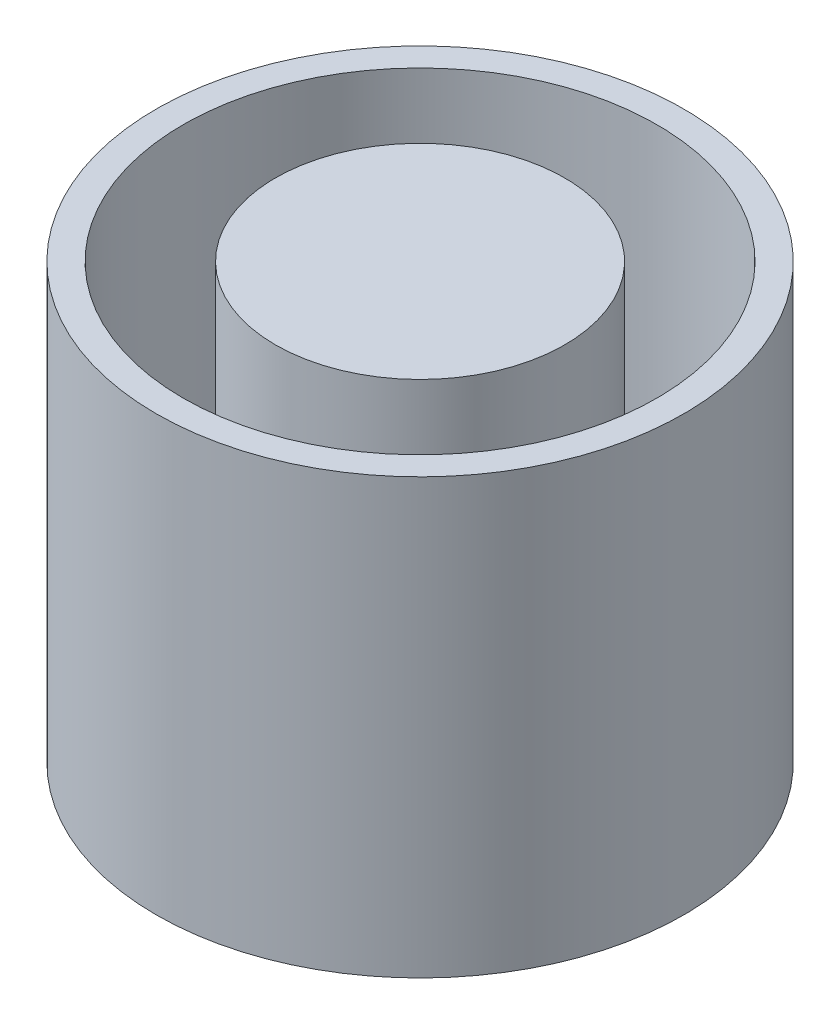
ISO-10303-21;
HEADER;
FILE_DESCRIPTION(('STEP AP214'),'2;1');
FILE_NAME('part.step','',(''),(''),'','','');
FILE_SCHEMA(('AUTOMOTIVE_DESIGN { 1 0 10303 214 1 1 1 1 }'));
ENDSEC;
DATA;
#1=APPLICATION_CONTEXT('core data for automotive mechanical design processes');
#2=APPLICATION_PROTOCOL_DEFINITION('international standard','automotive_design',2000,#1);
#3=PRODUCT_CONTEXT('',#1,'mechanical');
#4=PRODUCT('Part','Part','',(#3));
#5=PRODUCT_RELATED_PRODUCT_CATEGORY('part','',(#4));
#6=PRODUCT_DEFINITION_FORMATION('','',#4);
#7=PRODUCT_DEFINITION_CONTEXT('part definition',#1,'design');
#8=PRODUCT_DEFINITION('design','',#6,#7);
#9=PRODUCT_DEFINITION_SHAPE('','',#8);
#10=(LENGTH_UNIT() NAMED_UNIT(*) SI_UNIT(.MILLI.,.METRE.));
#11=(NAMED_UNIT(*) PLANE_ANGLE_UNIT() SI_UNIT($,.RADIAN.));
#12=(NAMED_UNIT(*) SI_UNIT($,.STERADIAN.) SOLID_ANGLE_UNIT());
#13=UNCERTAINTY_MEASURE_WITH_UNIT(LENGTH_MEASURE(1.E-05),#10,'distance_accuracy_value','');
#14=(GEOMETRIC_REPRESENTATION_CONTEXT(3) GLOBAL_UNCERTAINTY_ASSIGNED_CONTEXT((#13)) GLOBAL_UNIT_ASSIGNED_CONTEXT((#10,
#11,#12)) REPRESENTATION_CONTEXT('',''));
#15=CARTESIAN_POINT('',(0.,0.,0.));
#16=DIRECTION('',(0.,0.,1.));
#17=DIRECTION('',(1.,0.,0.));
#18=AXIS2_PLACEMENT_3D('',#15,#16,#17);
#19=CARTESIAN_POINT('',(0.,100.,0.));
#20=DIRECTION('',(0.,-1.,0.));
#21=DIRECTION('',(0.,0.,-1.));
#22=AXIS2_PLACEMENT_3D('',#19,#20,#21);
#23=CYLINDRICAL_SURFACE('',#22,54.5797701484338);
#24=CARTESIAN_POINT('',(0.,9.99999999999999,0.));
#25=DIRECTION('',(0.,1.,0.));
#26=DIRECTION('',(0.,0.,1.));
#27=AXIS2_PLACEMENT_3D('',#24,#25,#26);
#28=CIRCLE('',#27,54.5797701484338);
#29=CARTESIAN_POINT('',(0.,9.99999999999999,54.5797701484338));
#30=VERTEX_POINT('',#29);
#31=EDGE_CURVE('E11',#30,#30,#28,.T.);
#32=ORIENTED_EDGE('',*,*,#31,.F.);
#33=EDGE_LOOP('',(#32));
#34=FACE_BOUND('',#33,.T.);
#35=CARTESIAN_POINT('',(0.,100.,0.));
#36=DIRECTION('',(0.,1.,0.));
#37=DIRECTION('',(0.,0.,1.));
#38=AXIS2_PLACEMENT_3D('',#35,#36,#37);
#39=CIRCLE('',#38,54.5797701484338);
#40=CARTESIAN_POINT('',(0.,100.,54.5797701484338));
#41=VERTEX_POINT('',#40);
#42=EDGE_CURVE('E51',#41,#41,#39,.T.);
#43=ORIENTED_EDGE('',*,*,#42,.T.);
#44=EDGE_LOOP('',(#43));
#45=FACE_BOUND('',#44,.T.);
#46=ADVANCED_FACE('F41',(#34,#45),#23,.F.);
#47=CARTESIAN_POINT('',(0.,100.,0.));
#48=DIRECTION('',(0.,-1.,0.));
#49=DIRECTION('',(0.,0.,-1.));
#50=AXIS2_PLACEMENT_3D('',#47,#48,#49);
#51=CYLINDRICAL_SURFACE('',#50,60.8020056587238);
#52=CARTESIAN_POINT('',(0.,100.,0.));
#53=DIRECTION('',(0.,1.,0.));
#54=DIRECTION('',(0.,0.,1.));
#55=AXIS2_PLACEMENT_3D('',#52,#53,#54);
#56=CIRCLE('',#55,60.8020056587238);
#57=CARTESIAN_POINT('',(0.,100.,60.8020056587238));
#58=VERTEX_POINT('',#57);
#59=EDGE_CURVE('E47',#58,#58,#56,.T.);
#60=ORIENTED_EDGE('',*,*,#59,.F.);
#61=EDGE_LOOP('',(#60));
#62=FACE_BOUND('',#61,.T.);
#63=CARTESIAN_POINT('',(0.,0.,0.));
#64=DIRECTION('',(0.,1.,0.));
#65=DIRECTION('',(0.,0.,1.));
#66=AXIS2_PLACEMENT_3D('',#63,#64,#65);
#67=CIRCLE('',#66,60.8020056587238);
#68=CARTESIAN_POINT('',(0.,0.,60.8020056587238));
#69=VERTEX_POINT('',#68);
#70=EDGE_CURVE('E56',#69,#69,#67,.T.);
#71=ORIENTED_EDGE('',*,*,#70,.T.);
#72=EDGE_LOOP('',(#71));
#73=FACE_BOUND('',#72,.T.);
#74=ADVANCED_FACE('F90',(#62,#73),#51,.T.);
#75=CARTESIAN_POINT('',(0.,100.,0.));
#76=DIRECTION('',(0.,1.,0.));
#77=DIRECTION('',(0.,0.,1.));
#78=AXIS2_PLACEMENT_3D('',#75,#76,#77);
#79=PLANE('',#78);
#80=ORIENTED_EDGE('',*,*,#42,.F.);
#81=EDGE_LOOP('',(#80));
#82=FACE_BOUND('',#81,.T.);
#83=ORIENTED_EDGE('',*,*,#59,.T.);
#84=EDGE_LOOP('',(#83));
#85=FACE_BOUND('',#84,.T.);
#86=ADVANCED_FACE('F95',(#82,#85),#79,.T.);
#87=CARTESIAN_POINT('',(0.,0.,0.));
#88=DIRECTION('',(0.,1.,0.));
#89=DIRECTION('',(0.,0.,1.));
#90=AXIS2_PLACEMENT_3D('',#87,#88,#89);
#91=PLANE('',#90);
#92=ORIENTED_EDGE('',*,*,#70,.F.);
#93=EDGE_LOOP('',(#92));
#94=FACE_BOUND('',#93,.T.);
#95=CARTESIAN_POINT('',(0.,0.,0.));
#96=DIRECTION('',(0.,1.,0.));
#97=DIRECTION('',(0.,0.,1.));
#98=AXIS2_PLACEMENT_3D('',#95,#96,#97);
#99=CIRCLE('',#98,14.0708311486429);
#100=CARTESIAN_POINT('',(0.,0.,14.0708311486429));
#101=VERTEX_POINT('',#100);
#102=EDGE_CURVE('E68',#101,#101,#99,.T.);
#103=ORIENTED_EDGE('',*,*,#102,.T.);
#104=EDGE_LOOP('',(#103));
#105=FACE_BOUND('',#104,.T.);
#106=ADVANCED_FACE('F101',(#94,#105),#91,.F.);
#107=CARTESIAN_POINT('',(0.,10.,0.));
#108=DIRECTION('',(0.,1.,0.));
#109=DIRECTION('',(0.,0.,1.));
#110=AXIS2_PLACEMENT_3D('',#107,#108,#109);
#111=PLANE('',#110);
#112=CARTESIAN_POINT('',(0.,10.,0.));
#113=DIRECTION('',(0.,1.,0.));
#114=DIRECTION('',(0.,0.,1.));
#115=AXIS2_PLACEMENT_3D('',#112,#113,#114);
#116=CIRCLE('',#115,33.324434683967);
#117=CARTESIAN_POINT('',(0.,10.,33.324434683967));
#118=VERTEX_POINT('',#117);
#119=EDGE_CURVE('E60',#118,#118,#116,.T.);
#120=ORIENTED_EDGE('',*,*,#119,.F.);
#121=EDGE_LOOP('',(#120));
#122=FACE_BOUND('',#121,.T.);
#123=ORIENTED_EDGE('',*,*,#31,.T.);
#124=EDGE_LOOP('',(#123));
#125=FACE_BOUND('',#124,.T.);
#126=ADVANCED_FACE('F106',(#122,#125),#111,.T.);
#127=CARTESIAN_POINT('',(0.,100.,0.));
#128=DIRECTION('',(0.,1.,0.));
#129=DIRECTION('',(0.,0.,1.));
#130=AXIS2_PLACEMENT_3D('',#127,#128,#129);
#131=PLANE('',#130);
#132=CARTESIAN_POINT('',(0.,100.,0.));
#133=DIRECTION('',(0.,1.,0.));
#134=DIRECTION('',(0.,0.,1.));
#135=AXIS2_PLACEMENT_3D('',#132,#133,#134);
#136=CIRCLE('',#135,33.324434683967);
#137=CARTESIAN_POINT('',(0.,100.,33.324434683967));
#138=VERTEX_POINT('',#137);
#139=EDGE_CURVE('E64',#138,#138,#136,.T.);
#140=ORIENTED_EDGE('',*,*,#139,.T.);
#141=EDGE_LOOP('',(#140));
#142=FACE_BOUND('',#141,.T.);
#143=ADVANCED_FACE('F111',(#142),#131,.T.);
#144=CARTESIAN_POINT('',(0.,100.,0.));
#145=DIRECTION('',(0.,-1.,0.));
#146=DIRECTION('',(0.,0.,-1.));
#147=AXIS2_PLACEMENT_3D('',#144,#145,#146);
#148=CYLINDRICAL_SURFACE('',#147,33.324434683967);
#149=ORIENTED_EDGE('',*,*,#119,.T.);
#150=EDGE_LOOP('',(#149));
#151=FACE_BOUND('',#150,.T.);
#152=ORIENTED_EDGE('',*,*,#139,.F.);
#153=EDGE_LOOP('',(#152));
#154=FACE_BOUND('',#153,.T.);
#155=ADVANCED_FACE('F85',(#151,#154),#148,.T.);
#156=CARTESIAN_POINT('',(0.,100.,0.));
#157=DIRECTION('',(0.,-1.,0.));
#158=DIRECTION('',(0.,0.,-1.));
#159=AXIS2_PLACEMENT_3D('',#156,#157,#158);
#160=CYLINDRICAL_SURFACE('',#159,14.0708311486429);
#161=ORIENTED_EDGE('',*,*,#102,.F.);
#162=EDGE_LOOP('',(#161));
#163=FACE_BOUND('',#162,.T.);
#164=CARTESIAN_POINT('',(0.,90.,0.));
#165=DIRECTION('',(0.,1.,0.));
#166=DIRECTION('',(0.,0.,1.));
#167=AXIS2_PLACEMENT_3D('',#164,#165,#166);
#168=CIRCLE('',#167,14.0708311486429);
#169=CARTESIAN_POINT('',(0.,90.,14.0708311486429));
#170=VERTEX_POINT('',#169);
#171=EDGE_CURVE('E72',#170,#170,#168,.T.);
#172=ORIENTED_EDGE('',*,*,#171,.T.);
#173=EDGE_LOOP('',(#172));
#174=FACE_BOUND('',#173,.T.);
#175=ADVANCED_FACE('F77',(#163,#174),#160,.F.);
#176=CARTESIAN_POINT('',(0.,90.,0.));
#177=DIRECTION('',(0.,1.,0.));
#178=DIRECTION('',(0.,0.,1.));
#179=AXIS2_PLACEMENT_3D('',#176,#177,#178);
#180=PLANE('',#179);
#181=ORIENTED_EDGE('',*,*,#171,.F.);
#182=EDGE_LOOP('',(#181));
#183=FACE_BOUND('',#182,.T.);
#184=ADVANCED_FACE('F79',(#183),#180,.F.);
#185=CLOSED_SHELL('',(#46,#74,#86,#106,#126,#143,#155,#175,#184));
#186=MANIFOLD_SOLID_BREP('B2',#185);
#187=ADVANCED_BREP_SHAPE_REPRESENTATION('',(#18,#186),#14);
#188=SHAPE_DEFINITION_REPRESENTATION(#9,#187);
ENDSEC;
END-ISO-10303-21;
